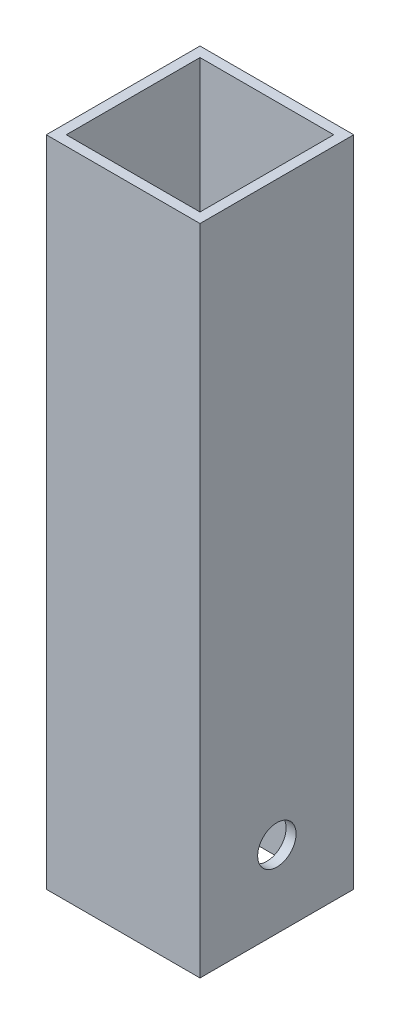
ISO-10303-21;
HEADER;
FILE_DESCRIPTION(('STEP AP214'),'2;1');
FILE_NAME('part.step','',(''),(''),'','','');
FILE_SCHEMA(('AUTOMOTIVE_DESIGN { 1 0 10303 214 1 1 1 1 }'));
ENDSEC;
DATA;
#1=APPLICATION_CONTEXT('core data for automotive mechanical design processes');
#2=APPLICATION_PROTOCOL_DEFINITION('international standard','automotive_design',2000,#1);
#3=PRODUCT_CONTEXT('',#1,'mechanical');
#4=PRODUCT('Part','Part','',(#3));
#5=PRODUCT_RELATED_PRODUCT_CATEGORY('part','',(#4));
#6=PRODUCT_DEFINITION_FORMATION('','',#4);
#7=PRODUCT_DEFINITION_CONTEXT('part definition',#1,'design');
#8=PRODUCT_DEFINITION('design','',#6,#7);
#9=PRODUCT_DEFINITION_SHAPE('','',#8);
#10=(LENGTH_UNIT() NAMED_UNIT(*) SI_UNIT(.MILLI.,.METRE.));
#11=(NAMED_UNIT(*) PLANE_ANGLE_UNIT() SI_UNIT($,.RADIAN.));
#12=(NAMED_UNIT(*) SI_UNIT($,.STERADIAN.) SOLID_ANGLE_UNIT());
#13=UNCERTAINTY_MEASURE_WITH_UNIT(LENGTH_MEASURE(1.E-05),#10,'distance_accuracy_value','');
#14=(GEOMETRIC_REPRESENTATION_CONTEXT(3) GLOBAL_UNCERTAINTY_ASSIGNED_CONTEXT((#13)) GLOBAL_UNIT_ASSIGNED_CONTEXT((#10,
#11,#12)) REPRESENTATION_CONTEXT('',''));
#15=CARTESIAN_POINT('',(0.,0.,0.));
#16=DIRECTION('',(0.,0.,1.));
#17=DIRECTION('',(1.,0.,0.));
#18=AXIS2_PLACEMENT_3D('',#15,#16,#17);
#19=CARTESIAN_POINT('',(0.,107.95,0.));
#20=DIRECTION('',(1.,0.,0.));
#21=DIRECTION('',(0.,0.,-1.));
#22=AXIS2_PLACEMENT_3D('',#19,#20,#21);
#23=PLANE('',#22);
#24=CARTESIAN_POINT('',(0.,12.7,12.7));
#25=DIRECTION('',(-1.,0.,0.));
#26=DIRECTION('',(0.,0.,1.));
#27=AXIS2_PLACEMENT_3D('',#24,#25,#26);
#28=CIRCLE('',#27,3.175);
#29=CARTESIAN_POINT('',(0.,12.7,15.875));
#30=VERTEX_POINT('',#29);
#31=EDGE_CURVE('E223',#30,#30,#28,.T.);
#32=ORIENTED_EDGE('',*,*,#31,.F.);
#33=EDGE_LOOP('',(#32));
#34=FACE_BOUND('',#33,.T.);
#35=DIRECTION('',(0.,0.,1.));
#36=VECTOR('',#35,1.);
#37=CARTESIAN_POINT('',(0.,0.,0.));
#38=LINE('',#37,#36);
#39=CARTESIAN_POINT('',(0.,0.,0.));
#40=VERTEX_POINT('',#39);
#41=CARTESIAN_POINT('',(0.,0.,25.4));
#42=VERTEX_POINT('',#41);
#43=EDGE_CURVE('E134',#40,#42,#38,.T.);
#44=ORIENTED_EDGE('',*,*,#43,.T.);
#45=DIRECTION('',(0.,-1.,0.));
#46=VECTOR('',#45,1.);
#47=CARTESIAN_POINT('',(0.,107.95,25.4));
#48=LINE('',#47,#46);
#49=CARTESIAN_POINT('',(0.,107.95,25.4));
#50=VERTEX_POINT('',#49);
#51=EDGE_CURVE('E11',#50,#42,#48,.T.);
#52=ORIENTED_EDGE('',*,*,#51,.F.);
#53=DIRECTION('',(0.,0.,1.));
#54=VECTOR('',#53,1.);
#55=CARTESIAN_POINT('',(0.,107.95,0.));
#56=LINE('',#55,#54);
#57=CARTESIAN_POINT('',(0.,107.95,0.));
#58=VERTEX_POINT('',#57);
#59=EDGE_CURVE('E138',#58,#50,#56,.T.);
#60=ORIENTED_EDGE('',*,*,#59,.F.);
#61=DIRECTION('',(0.,-1.,0.));
#62=VECTOR('',#61,1.);
#63=CARTESIAN_POINT('',(0.,107.95,0.));
#64=LINE('',#63,#62);
#65=EDGE_CURVE('E148',#58,#40,#64,.T.);
#66=ORIENTED_EDGE('',*,*,#65,.T.);
#67=EDGE_LOOP('',(#44,#52,#60,#66));
#68=FACE_BOUND('',#67,.T.);
#69=ADVANCED_FACE('F33',(#34,#68),#23,.F.);
#70=CARTESIAN_POINT('',(0.,107.95,25.4));
#71=DIRECTION('',(0.,0.,-1.));
#72=DIRECTION('',(-1.,0.,0.));
#73=AXIS2_PLACEMENT_3D('',#70,#71,#72);
#74=PLANE('',#73);
#75=DIRECTION('',(1.,0.,0.));
#76=VECTOR('',#75,1.);
#77=CARTESIAN_POINT('',(0.,0.,25.4));
#78=LINE('',#77,#76);
#79=CARTESIAN_POINT('',(25.4,0.,25.4));
#80=VERTEX_POINT('',#79);
#81=EDGE_CURVE('E151',#42,#80,#78,.T.);
#82=ORIENTED_EDGE('',*,*,#81,.T.);
#83=DIRECTION('',(0.,-1.,0.));
#84=VECTOR('',#83,1.);
#85=CARTESIAN_POINT('',(25.4,107.95,25.4));
#86=LINE('',#85,#84);
#87=CARTESIAN_POINT('',(25.4,107.95,25.4));
#88=VERTEX_POINT('',#87);
#89=EDGE_CURVE('E41',#88,#80,#86,.T.);
#90=ORIENTED_EDGE('',*,*,#89,.F.);
#91=DIRECTION('',(1.,0.,0.));
#92=VECTOR('',#91,1.);
#93=CARTESIAN_POINT('',(0.,107.95,25.4));
#94=LINE('',#93,#92);
#95=EDGE_CURVE('E141',#50,#88,#94,.T.);
#96=ORIENTED_EDGE('',*,*,#95,.F.);
#97=ORIENTED_EDGE('',*,*,#51,.T.);
#98=EDGE_LOOP('',(#82,#90,#96,#97));
#99=FACE_BOUND('',#98,.T.);
#100=ADVANCED_FACE('F180',(#99),#74,.F.);
#101=CARTESIAN_POINT('',(25.4,107.95,0.));
#102=DIRECTION('',(-1.,0.,0.));
#103=DIRECTION('',(0.,0.,1.));
#104=AXIS2_PLACEMENT_3D('',#101,#102,#103);
#105=PLANE('',#104);
#106=CARTESIAN_POINT('',(25.4,12.7,12.7));
#107=DIRECTION('',(-1.,0.,0.));
#108=DIRECTION('',(0.,0.,1.));
#109=AXIS2_PLACEMENT_3D('',#106,#107,#108);
#110=CIRCLE('',#109,3.175);
#111=CARTESIAN_POINT('',(25.4,12.7,15.875));
#112=VERTEX_POINT('',#111);
#113=EDGE_CURVE('E227',#112,#112,#110,.T.);
#114=ORIENTED_EDGE('',*,*,#113,.T.);
#115=EDGE_LOOP('',(#114));
#116=FACE_BOUND('',#115,.T.);
#117=DIRECTION('',(0.,0.,-1.));
#118=VECTOR('',#117,1.);
#119=CARTESIAN_POINT('',(25.4,0.,0.));
#120=LINE('',#119,#118);
#121=CARTESIAN_POINT('',(25.4,0.,0.));
#122=VERTEX_POINT('',#121);
#123=EDGE_CURVE('E153',#80,#122,#120,.T.);
#124=ORIENTED_EDGE('',*,*,#123,.T.);
#125=DIRECTION('',(0.,-1.,0.));
#126=VECTOR('',#125,1.);
#127=CARTESIAN_POINT('',(25.4,107.95,0.));
#128=LINE('',#127,#126);
#129=CARTESIAN_POINT('',(25.4,107.95,0.));
#130=VERTEX_POINT('',#129);
#131=EDGE_CURVE('E158',#130,#122,#128,.T.);
#132=ORIENTED_EDGE('',*,*,#131,.F.);
#133=DIRECTION('',(0.,0.,-1.));
#134=VECTOR('',#133,1.);
#135=CARTESIAN_POINT('',(25.4,107.95,0.));
#136=LINE('',#135,#134);
#137=EDGE_CURVE('E144',#88,#130,#136,.T.);
#138=ORIENTED_EDGE('',*,*,#137,.F.);
#139=ORIENTED_EDGE('',*,*,#89,.T.);
#140=EDGE_LOOP('',(#124,#132,#138,#139));
#141=FACE_BOUND('',#140,.T.);
#142=ADVANCED_FACE('F166',(#116,#141),#105,.F.);
#143=CARTESIAN_POINT('',(0.,107.95,0.));
#144=DIRECTION('',(0.,0.,1.));
#145=DIRECTION('',(1.,0.,0.));
#146=AXIS2_PLACEMENT_3D('',#143,#144,#145);
#147=PLANE('',#146);
#148=DIRECTION('',(-1.,0.,0.));
#149=VECTOR('',#148,1.);
#150=CARTESIAN_POINT('',(0.,0.,0.));
#151=LINE('',#150,#149);
#152=EDGE_CURVE('E142',#122,#40,#151,.T.);
#153=ORIENTED_EDGE('',*,*,#152,.T.);
#154=ORIENTED_EDGE('',*,*,#65,.F.);
#155=DIRECTION('',(-1.,0.,0.));
#156=VECTOR('',#155,1.);
#157=CARTESIAN_POINT('',(0.,107.95,0.));
#158=LINE('',#157,#156);
#159=EDGE_CURVE('E146',#130,#58,#158,.T.);
#160=ORIENTED_EDGE('',*,*,#159,.F.);
#161=ORIENTED_EDGE('',*,*,#131,.T.);
#162=EDGE_LOOP('',(#153,#154,#160,#161));
#163=FACE_BOUND('',#162,.T.);
#164=ADVANCED_FACE('F173',(#163),#147,.F.);
#165=CARTESIAN_POINT('',(0.,107.95,0.));
#166=DIRECTION('',(0.,1.,0.));
#167=DIRECTION('',(0.,0.,1.));
#168=AXIS2_PLACEMENT_3D('',#165,#166,#167);
#169=PLANE('',#168);
#170=DIRECTION('',(0.,0.,1.));
#171=VECTOR('',#170,1.);
#172=CARTESIAN_POINT('',(1.651,107.95,1.651));
#173=LINE('',#172,#171);
#174=CARTESIAN_POINT('',(1.651,107.95,1.651));
#175=VERTEX_POINT('',#174);
#176=CARTESIAN_POINT('',(1.651,107.95,23.749));
#177=VERTEX_POINT('',#176);
#178=EDGE_CURVE('E48',#175,#177,#173,.T.);
#179=ORIENTED_EDGE('',*,*,#178,.F.);
#180=DIRECTION('',(-1.,0.,0.));
#181=VECTOR('',#180,1.);
#182=CARTESIAN_POINT('',(1.651,107.95,1.651));
#183=LINE('',#182,#181);
#184=CARTESIAN_POINT('',(23.749,107.95,1.651));
#185=VERTEX_POINT('',#184);
#186=EDGE_CURVE('E116',#185,#175,#183,.T.);
#187=ORIENTED_EDGE('',*,*,#186,.F.);
#188=DIRECTION('',(0.,0.,-1.));
#189=VECTOR('',#188,1.);
#190=CARTESIAN_POINT('',(23.749,107.95,1.651));
#191=LINE('',#190,#189);
#192=CARTESIAN_POINT('',(23.749,107.95,23.749));
#193=VERTEX_POINT('',#192);
#194=EDGE_CURVE('E119',#193,#185,#191,.T.);
#195=ORIENTED_EDGE('',*,*,#194,.F.);
#196=DIRECTION('',(1.,0.,0.));
#197=VECTOR('',#196,1.);
#198=CARTESIAN_POINT('',(1.651,107.95,23.749));
#199=LINE('',#198,#197);
#200=EDGE_CURVE('E128',#177,#193,#199,.T.);
#201=ORIENTED_EDGE('',*,*,#200,.F.);
#202=EDGE_LOOP('',(#179,#187,#195,#201));
#203=FACE_BOUND('',#202,.T.);
#204=ORIENTED_EDGE('',*,*,#59,.T.);
#205=ORIENTED_EDGE('',*,*,#95,.T.);
#206=ORIENTED_EDGE('',*,*,#137,.T.);
#207=ORIENTED_EDGE('',*,*,#159,.T.);
#208=EDGE_LOOP('',(#204,#205,#206,#207));
#209=FACE_BOUND('',#208,.T.);
#210=ADVANCED_FACE('F179',(#203,#209),#169,.T.);
#211=CARTESIAN_POINT('',(0.,0.,0.));
#212=DIRECTION('',(0.,1.,0.));
#213=DIRECTION('',(0.,0.,1.));
#214=AXIS2_PLACEMENT_3D('',#211,#212,#213);
#215=PLANE('',#214);
#216=DIRECTION('',(-1.,0.,0.));
#217=VECTOR('',#216,1.);
#218=CARTESIAN_POINT('',(1.651,0.,1.651));
#219=LINE('',#218,#217);
#220=CARTESIAN_POINT('',(23.749,0.,1.651));
#221=VERTEX_POINT('',#220);
#222=CARTESIAN_POINT('',(1.651,0.,1.651));
#223=VERTEX_POINT('',#222);
#224=EDGE_CURVE('E106',#221,#223,#219,.T.);
#225=ORIENTED_EDGE('',*,*,#224,.T.);
#226=DIRECTION('',(0.,0.,1.));
#227=VECTOR('',#226,1.);
#228=CARTESIAN_POINT('',(1.651,0.,1.651));
#229=LINE('',#228,#227);
#230=CARTESIAN_POINT('',(1.651,0.,23.749));
#231=VERTEX_POINT('',#230);
#232=EDGE_CURVE('E100',#223,#231,#229,.T.);
#233=ORIENTED_EDGE('',*,*,#232,.T.);
#234=DIRECTION('',(1.,0.,0.));
#235=VECTOR('',#234,1.);
#236=CARTESIAN_POINT('',(1.651,0.,23.749));
#237=LINE('',#236,#235);
#238=CARTESIAN_POINT('',(23.749,0.,23.749));
#239=VERTEX_POINT('',#238);
#240=EDGE_CURVE('E109',#231,#239,#237,.T.);
#241=ORIENTED_EDGE('',*,*,#240,.T.);
#242=DIRECTION('',(0.,0.,-1.));
#243=VECTOR('',#242,1.);
#244=CARTESIAN_POINT('',(23.749,0.,1.651));
#245=LINE('',#244,#243);
#246=EDGE_CURVE('E56',#239,#221,#245,.T.);
#247=ORIENTED_EDGE('',*,*,#246,.T.);
#248=EDGE_LOOP('',(#225,#233,#241,#247));
#249=FACE_BOUND('',#248,.T.);
#250=ORIENTED_EDGE('',*,*,#43,.F.);
#251=ORIENTED_EDGE('',*,*,#152,.F.);
#252=ORIENTED_EDGE('',*,*,#123,.F.);
#253=ORIENTED_EDGE('',*,*,#81,.F.);
#254=EDGE_LOOP('',(#250,#251,#252,#253));
#255=FACE_BOUND('',#254,.T.);
#256=ADVANCED_FACE('F113',(#249,#255),#215,.F.);
#257=CARTESIAN_POINT('',(1.651,0.,1.651));
#258=DIRECTION('',(-1.,0.,0.));
#259=DIRECTION('',(0.,0.,1.));
#260=AXIS2_PLACEMENT_3D('',#257,#258,#259);
#261=PLANE('',#260);
#262=CARTESIAN_POINT('',(1.651,12.7,12.7));
#263=DIRECTION('',(-1.,0.,0.));
#264=DIRECTION('',(0.,0.,1.));
#265=AXIS2_PLACEMENT_3D('',#262,#263,#264);
#266=CIRCLE('',#265,3.175);
#267=CARTESIAN_POINT('',(1.651,12.7,15.875));
#268=VERTEX_POINT('',#267);
#269=EDGE_CURVE('E122',#268,#268,#266,.T.);
#270=ORIENTED_EDGE('',*,*,#269,.T.);
#271=EDGE_LOOP('',(#270));
#272=FACE_BOUND('',#271,.T.);
#273=ORIENTED_EDGE('',*,*,#178,.T.);
#274=DIRECTION('',(0.,1.,0.));
#275=VECTOR('',#274,1.);
#276=CARTESIAN_POINT('',(1.651,0.,23.749));
#277=LINE('',#276,#275);
#278=EDGE_CURVE('E96',#231,#177,#277,.T.);
#279=ORIENTED_EDGE('',*,*,#278,.F.);
#280=ORIENTED_EDGE('',*,*,#232,.F.);
#281=DIRECTION('',(0.,1.,0.));
#282=VECTOR('',#281,1.);
#283=CARTESIAN_POINT('',(1.651,0.,1.651));
#284=LINE('',#283,#282);
#285=EDGE_CURVE('E132',#223,#175,#284,.T.);
#286=ORIENTED_EDGE('',*,*,#285,.T.);
#287=EDGE_LOOP('',(#273,#279,#280,#286));
#288=FACE_BOUND('',#287,.T.);
#289=ADVANCED_FACE('F98',(#272,#288),#261,.F.);
#290=CARTESIAN_POINT('',(1.651,0.,1.651));
#291=DIRECTION('',(0.,0.,-1.));
#292=DIRECTION('',(-1.,0.,0.));
#293=AXIS2_PLACEMENT_3D('',#290,#291,#292);
#294=PLANE('',#293);
#295=ORIENTED_EDGE('',*,*,#186,.T.);
#296=ORIENTED_EDGE('',*,*,#285,.F.);
#297=ORIENTED_EDGE('',*,*,#224,.F.);
#298=DIRECTION('',(0.,1.,0.));
#299=VECTOR('',#298,1.);
#300=CARTESIAN_POINT('',(23.749,0.,1.651));
#301=LINE('',#300,#299);
#302=EDGE_CURVE('E135',#221,#185,#301,.T.);
#303=ORIENTED_EDGE('',*,*,#302,.T.);
#304=EDGE_LOOP('',(#295,#296,#297,#303));
#305=FACE_BOUND('',#304,.T.);
#306=ADVANCED_FACE('F201',(#305),#294,.F.);
#307=CARTESIAN_POINT('',(23.749,0.,1.651));
#308=DIRECTION('',(1.,0.,0.));
#309=DIRECTION('',(0.,0.,-1.));
#310=AXIS2_PLACEMENT_3D('',#307,#308,#309);
#311=PLANE('',#310);
#312=CARTESIAN_POINT('',(23.749,12.7,12.7));
#313=DIRECTION('',(1.,0.,0.));
#314=DIRECTION('',(0.,0.,-1.));
#315=AXIS2_PLACEMENT_3D('',#312,#313,#314);
#316=CIRCLE('',#315,3.175);
#317=CARTESIAN_POINT('',(23.749,12.7,9.525));
#318=VERTEX_POINT('',#317);
#319=EDGE_CURVE('E36',#318,#318,#316,.T.);
#320=ORIENTED_EDGE('',*,*,#319,.T.);
#321=EDGE_LOOP('',(#320));
#322=FACE_BOUND('',#321,.T.);
#323=ORIENTED_EDGE('',*,*,#194,.T.);
#324=ORIENTED_EDGE('',*,*,#302,.F.);
#325=ORIENTED_EDGE('',*,*,#246,.F.);
#326=DIRECTION('',(0.,1.,0.));
#327=VECTOR('',#326,1.);
#328=CARTESIAN_POINT('',(23.749,0.,23.749));
#329=LINE('',#328,#327);
#330=EDGE_CURVE('E105',#239,#193,#329,.T.);
#331=ORIENTED_EDGE('',*,*,#330,.T.);
#332=EDGE_LOOP('',(#323,#324,#325,#331));
#333=FACE_BOUND('',#332,.T.);
#334=ADVANCED_FACE('F206',(#322,#333),#311,.F.);
#335=CARTESIAN_POINT('',(1.651,0.,23.749));
#336=DIRECTION('',(0.,0.,1.));
#337=DIRECTION('',(1.,0.,0.));
#338=AXIS2_PLACEMENT_3D('',#335,#336,#337);
#339=PLANE('',#338);
#340=ORIENTED_EDGE('',*,*,#200,.T.);
#341=ORIENTED_EDGE('',*,*,#330,.F.);
#342=ORIENTED_EDGE('',*,*,#240,.F.);
#343=ORIENTED_EDGE('',*,*,#278,.T.);
#344=EDGE_LOOP('',(#340,#341,#342,#343));
#345=FACE_BOUND('',#344,.T.);
#346=ADVANCED_FACE('F110',(#345),#339,.F.);
#347=CARTESIAN_POINT('',(25.4,12.7,12.7));
#348=DIRECTION('',(-1.,0.,0.));
#349=DIRECTION('',(0.,0.,1.));
#350=AXIS2_PLACEMENT_3D('',#347,#348,#349);
#351=CYLINDRICAL_SURFACE('',#350,3.175);
#352=ORIENTED_EDGE('',*,*,#113,.F.);
#353=EDGE_LOOP('',(#352));
#354=FACE_BOUND('',#353,.T.);
#355=ORIENTED_EDGE('',*,*,#319,.F.);
#356=EDGE_LOOP('',(#355));
#357=FACE_BOUND('',#356,.T.);
#358=ADVANCED_FACE('F205',(#354,#357),#351,.F.);
#359=ORIENTED_EDGE('',*,*,#31,.T.);
#360=EDGE_LOOP('',(#359));
#361=FACE_BOUND('',#360,.T.);
#362=ORIENTED_EDGE('',*,*,#269,.F.);
#363=EDGE_LOOP('',(#362));
#364=FACE_BOUND('',#363,.T.);
#365=ADVANCED_FACE('F213',(#361,#364),#351,.F.);
#366=CLOSED_SHELL('',(#69,#100,#142,#164,#210,#256,#289,#306,#334,#346,#358,#365));
#367=MANIFOLD_SOLID_BREP('B2',#366);
#368=ADVANCED_BREP_SHAPE_REPRESENTATION('',(#18,#367),#14);
#369=SHAPE_DEFINITION_REPRESENTATION(#9,#368);
ENDSEC;
END-ISO-10303-21;
